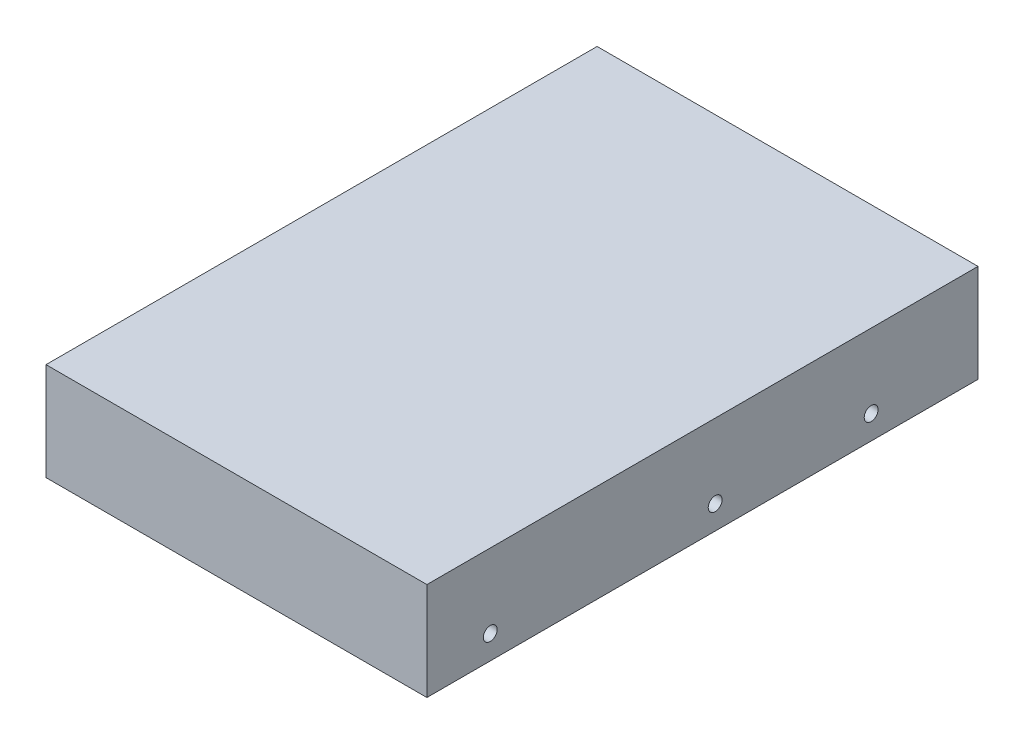
ISO-10303-21;
HEADER;
FILE_DESCRIPTION(('STEP AP214'),'2;1');
FILE_NAME('part.step','',(''),(''),'','','');
FILE_SCHEMA(('AUTOMOTIVE_DESIGN { 1 0 10303 214 1 1 1 1 }'));
ENDSEC;
DATA;
#1=APPLICATION_CONTEXT('core data for automotive mechanical design processes');
#2=APPLICATION_PROTOCOL_DEFINITION('international standard','automotive_design',2000,#1);
#3=PRODUCT_CONTEXT('',#1,'mechanical');
#4=PRODUCT('Part','Part','',(#3));
#5=PRODUCT_RELATED_PRODUCT_CATEGORY('part','',(#4));
#6=PRODUCT_DEFINITION_FORMATION('','',#4);
#7=PRODUCT_DEFINITION_CONTEXT('part definition',#1,'design');
#8=PRODUCT_DEFINITION('design','',#6,#7);
#9=PRODUCT_DEFINITION_SHAPE('','',#8);
#10=(LENGTH_UNIT() NAMED_UNIT(*) SI_UNIT(.MILLI.,.METRE.));
#11=(NAMED_UNIT(*) PLANE_ANGLE_UNIT() SI_UNIT($,.RADIAN.));
#12=(NAMED_UNIT(*) SI_UNIT($,.STERADIAN.) SOLID_ANGLE_UNIT());
#13=UNCERTAINTY_MEASURE_WITH_UNIT(LENGTH_MEASURE(1.E-05),#10,'distance_accuracy_value','');
#14=(GEOMETRIC_REPRESENTATION_CONTEXT(3) GLOBAL_UNCERTAINTY_ASSIGNED_CONTEXT((#13)) GLOBAL_UNIT_ASSIGNED_CONTEXT((#10,
#11,#12)) REPRESENTATION_CONTEXT('',''));
#15=CARTESIAN_POINT('',(0.,0.,0.));
#16=DIRECTION('',(0.,0.,1.));
#17=DIRECTION('',(1.,0.,0.));
#18=AXIS2_PLACEMENT_3D('',#15,#16,#17);
#19=CARTESIAN_POINT('',(0.,26.1,0.));
#20=DIRECTION('',(1.,0.,0.));
#21=DIRECTION('',(0.,0.,-1.));
#22=AXIS2_PLACEMENT_3D('',#19,#20,#21);
#23=PLANE('',#22);
#24=CARTESIAN_POINT('',(0.,6.35,-16.9));
#25=DIRECTION('',(-1.,0.,0.));
#26=DIRECTION('',(0.,0.,1.));
#27=AXIS2_PLACEMENT_3D('',#24,#25,#26);
#28=CIRCLE('',#27,1.85);
#29=CARTESIAN_POINT('',(0.,6.35,-15.05));
#30=VERTEX_POINT('',#29);
#31=EDGE_CURVE('E112',#30,#30,#28,.T.);
#32=ORIENTED_EDGE('',*,*,#31,.F.);
#33=EDGE_LOOP('',(#32));
#34=FACE_BOUND('',#33,.T.);
#35=CARTESIAN_POINT('',(0.,6.35,-76.89));
#36=DIRECTION('',(-1.,0.,0.));
#37=DIRECTION('',(0.,0.,1.));
#38=AXIS2_PLACEMENT_3D('',#35,#36,#37);
#39=CIRCLE('',#38,1.85);
#40=CARTESIAN_POINT('',(0.,6.35,-75.04));
#41=VERTEX_POINT('',#40);
#42=EDGE_CURVE('E111',#41,#41,#39,.T.);
#43=ORIENTED_EDGE('',*,*,#42,.F.);
#44=EDGE_LOOP('',(#43));
#45=FACE_BOUND('',#44,.T.);
#46=CARTESIAN_POINT('',(0.,6.35,-118.5));
#47=DIRECTION('',(-1.,0.,0.));
#48=DIRECTION('',(0.,0.,1.));
#49=AXIS2_PLACEMENT_3D('',#46,#47,#48);
#50=CIRCLE('',#49,1.85);
#51=CARTESIAN_POINT('',(0.,6.35,-116.65));
#52=VERTEX_POINT('',#51);
#53=EDGE_CURVE('E122',#52,#52,#50,.T.);
#54=ORIENTED_EDGE('',*,*,#53,.F.);
#55=EDGE_LOOP('',(#54));
#56=FACE_BOUND('',#55,.T.);
#57=DIRECTION('',(0.,0.,1.));
#58=VECTOR('',#57,1.);
#59=CARTESIAN_POINT('',(0.,0.,0.));
#60=LINE('',#59,#58);
#61=CARTESIAN_POINT('',(0.,0.,-147.));
#62=VERTEX_POINT('',#61);
#63=CARTESIAN_POINT('',(0.,0.,0.));
#64=VERTEX_POINT('',#63);
#65=EDGE_CURVE('E146',#62,#64,#60,.T.);
#66=ORIENTED_EDGE('',*,*,#65,.T.);
#67=DIRECTION('',(0.,-1.,0.));
#68=VECTOR('',#67,1.);
#69=CARTESIAN_POINT('',(0.,26.1,0.));
#70=LINE('',#69,#68);
#71=CARTESIAN_POINT('',(0.,26.1,0.));
#72=VERTEX_POINT('',#71);
#73=EDGE_CURVE('E11',#72,#64,#70,.T.);
#74=ORIENTED_EDGE('',*,*,#73,.F.);
#75=DIRECTION('',(0.,0.,1.));
#76=VECTOR('',#75,1.);
#77=CARTESIAN_POINT('',(0.,26.1,0.));
#78=LINE('',#77,#76);
#79=CARTESIAN_POINT('',(0.,26.1,-147.));
#80=VERTEX_POINT('',#79);
#81=EDGE_CURVE('E147',#80,#72,#78,.T.);
#82=ORIENTED_EDGE('',*,*,#81,.F.);
#83=DIRECTION('',(0.,-1.,0.));
#84=VECTOR('',#83,1.);
#85=CARTESIAN_POINT('',(0.,26.1,-147.));
#86=LINE('',#85,#84);
#87=EDGE_CURVE('E153',#80,#62,#86,.T.);
#88=ORIENTED_EDGE('',*,*,#87,.T.);
#89=EDGE_LOOP('',(#66,#74,#82,#88));
#90=FACE_BOUND('',#89,.T.);
#91=ADVANCED_FACE('F35',(#34,#45,#56,#90),#23,.F.);
#92=CARTESIAN_POINT('',(0.,26.1,0.));
#93=DIRECTION('',(0.,0.,-1.));
#94=DIRECTION('',(-1.,0.,0.));
#95=AXIS2_PLACEMENT_3D('',#92,#93,#94);
#96=PLANE('',#95);
#97=DIRECTION('',(1.,0.,0.));
#98=VECTOR('',#97,1.);
#99=CARTESIAN_POINT('',(0.,0.,0.));
#100=LINE('',#99,#98);
#101=CARTESIAN_POINT('',(101.6,0.,0.));
#102=VERTEX_POINT('',#101);
#103=EDGE_CURVE('E156',#64,#102,#100,.T.);
#104=ORIENTED_EDGE('',*,*,#103,.T.);
#105=DIRECTION('',(0.,-1.,0.));
#106=VECTOR('',#105,1.);
#107=CARTESIAN_POINT('',(101.6,26.1,0.));
#108=LINE('',#107,#106);
#109=CARTESIAN_POINT('',(101.6,26.1,0.));
#110=VERTEX_POINT('',#109);
#111=EDGE_CURVE('E43',#110,#102,#108,.T.);
#112=ORIENTED_EDGE('',*,*,#111,.F.);
#113=DIRECTION('',(1.,0.,0.));
#114=VECTOR('',#113,1.);
#115=CARTESIAN_POINT('',(0.,26.1,0.));
#116=LINE('',#115,#114);
#117=EDGE_CURVE('E82',#72,#110,#116,.T.);
#118=ORIENTED_EDGE('',*,*,#117,.F.);
#119=ORIENTED_EDGE('',*,*,#73,.T.);
#120=EDGE_LOOP('',(#104,#112,#118,#119));
#121=FACE_BOUND('',#120,.T.);
#122=ADVANCED_FACE('F179',(#121),#96,.F.);
#123=CARTESIAN_POINT('',(101.6,26.1,0.));
#124=DIRECTION('',(-1.,0.,0.));
#125=DIRECTION('',(0.,0.,1.));
#126=AXIS2_PLACEMENT_3D('',#123,#124,#125);
#127=PLANE('',#126);
#128=CARTESIAN_POINT('',(101.6,6.35,-16.9));
#129=DIRECTION('',(1.,0.,0.));
#130=DIRECTION('',(0.,0.,-1.));
#131=AXIS2_PLACEMENT_3D('',#128,#129,#130);
#132=CIRCLE('',#131,1.85);
#133=CARTESIAN_POINT('',(101.6,6.35,-18.75));
#134=VERTEX_POINT('',#133);
#135=EDGE_CURVE('E128',#134,#134,#132,.T.);
#136=ORIENTED_EDGE('',*,*,#135,.F.);
#137=EDGE_LOOP('',(#136));
#138=FACE_BOUND('',#137,.T.);
#139=CARTESIAN_POINT('',(101.6,6.35,-76.89));
#140=DIRECTION('',(1.,0.,0.));
#141=DIRECTION('',(0.,0.,-1.));
#142=AXIS2_PLACEMENT_3D('',#139,#140,#141);
#143=CIRCLE('',#142,1.85);
#144=CARTESIAN_POINT('',(101.6,6.35,-78.74));
#145=VERTEX_POINT('',#144);
#146=EDGE_CURVE('E134',#145,#145,#143,.T.);
#147=ORIENTED_EDGE('',*,*,#146,.F.);
#148=EDGE_LOOP('',(#147));
#149=FACE_BOUND('',#148,.T.);
#150=CARTESIAN_POINT('',(101.6,6.35,-118.5));
#151=DIRECTION('',(1.,0.,0.));
#152=DIRECTION('',(0.,0.,-1.));
#153=AXIS2_PLACEMENT_3D('',#150,#151,#152);
#154=CIRCLE('',#153,1.85);
#155=CARTESIAN_POINT('',(101.6,6.35,-120.35));
#156=VERTEX_POINT('',#155);
#157=EDGE_CURVE('E140',#156,#156,#154,.T.);
#158=ORIENTED_EDGE('',*,*,#157,.F.);
#159=EDGE_LOOP('',(#158));
#160=FACE_BOUND('',#159,.T.);
#161=DIRECTION('',(0.,0.,-1.));
#162=VECTOR('',#161,1.);
#163=CARTESIAN_POINT('',(101.6,0.,0.));
#164=LINE('',#163,#162);
#165=CARTESIAN_POINT('',(101.6,0.,-147.));
#166=VERTEX_POINT('',#165);
#167=EDGE_CURVE('E69',#102,#166,#164,.T.);
#168=ORIENTED_EDGE('',*,*,#167,.T.);
#169=DIRECTION('',(0.,-1.,0.));
#170=VECTOR('',#169,1.);
#171=CARTESIAN_POINT('',(101.6,26.1,-147.));
#172=LINE('',#171,#170);
#173=CARTESIAN_POINT('',(101.6,26.1,-147.));
#174=VERTEX_POINT('',#173);
#175=EDGE_CURVE('E161',#174,#166,#172,.T.);
#176=ORIENTED_EDGE('',*,*,#175,.F.);
#177=DIRECTION('',(0.,0.,-1.));
#178=VECTOR('',#177,1.);
#179=CARTESIAN_POINT('',(101.6,26.1,0.));
#180=LINE('',#179,#178);
#181=EDGE_CURVE('E150',#110,#174,#180,.T.);
#182=ORIENTED_EDGE('',*,*,#181,.F.);
#183=ORIENTED_EDGE('',*,*,#111,.T.);
#184=EDGE_LOOP('',(#168,#176,#182,#183));
#185=FACE_BOUND('',#184,.T.);
#186=ADVANCED_FACE('F163',(#138,#149,#160,#185),#127,.F.);
#187=CARTESIAN_POINT('',(0.,26.1,-147.));
#188=DIRECTION('',(0.,0.,1.));
#189=DIRECTION('',(1.,0.,0.));
#190=AXIS2_PLACEMENT_3D('',#187,#188,#189);
#191=PLANE('',#190);
#192=DIRECTION('',(-1.,0.,0.));
#193=VECTOR('',#192,1.);
#194=CARTESIAN_POINT('',(0.,0.,-147.));
#195=LINE('',#194,#193);
#196=EDGE_CURVE('E75',#166,#62,#195,.T.);
#197=ORIENTED_EDGE('',*,*,#196,.T.);
#198=ORIENTED_EDGE('',*,*,#87,.F.);
#199=DIRECTION('',(-1.,0.,0.));
#200=VECTOR('',#199,1.);
#201=CARTESIAN_POINT('',(0.,26.1,-147.));
#202=LINE('',#201,#200);
#203=EDGE_CURVE('E51',#174,#80,#202,.T.);
#204=ORIENTED_EDGE('',*,*,#203,.F.);
#205=ORIENTED_EDGE('',*,*,#175,.T.);
#206=EDGE_LOOP('',(#197,#198,#204,#205));
#207=FACE_BOUND('',#206,.T.);
#208=ADVANCED_FACE('F170',(#207),#191,.F.);
#209=CARTESIAN_POINT('',(0.,26.1,0.));
#210=DIRECTION('',(0.,-1.,0.));
#211=DIRECTION('',(0.,0.,-1.));
#212=AXIS2_PLACEMENT_3D('',#209,#210,#211);
#213=PLANE('',#212);
#214=ORIENTED_EDGE('',*,*,#81,.T.);
#215=ORIENTED_EDGE('',*,*,#117,.T.);
#216=ORIENTED_EDGE('',*,*,#181,.T.);
#217=ORIENTED_EDGE('',*,*,#203,.T.);
#218=EDGE_LOOP('',(#214,#215,#216,#217));
#219=FACE_BOUND('',#218,.T.);
#220=ADVANCED_FACE('F172',(#219),#213,.F.);
#221=CARTESIAN_POINT('',(0.,0.,0.));
#222=DIRECTION('',(0.,-1.,0.));
#223=DIRECTION('',(0.,0.,-1.));
#224=AXIS2_PLACEMENT_3D('',#221,#222,#223);
#225=PLANE('',#224);
#226=ORIENTED_EDGE('',*,*,#65,.F.);
#227=ORIENTED_EDGE('',*,*,#196,.F.);
#228=ORIENTED_EDGE('',*,*,#167,.F.);
#229=ORIENTED_EDGE('',*,*,#103,.F.);
#230=EDGE_LOOP('',(#226,#227,#228,#229));
#231=FACE_BOUND('',#230,.T.);
#232=ADVANCED_FACE('F166',(#231),#225,.T.);
#233=CARTESIAN_POINT('',(97.1,6.35,-118.5));
#234=DIRECTION('',(1.,0.,0.));
#235=DIRECTION('',(0.,0.,-1.));
#236=AXIS2_PLACEMENT_3D('',#233,#234,#235);
#237=CONICAL_SURFACE('',#236,1.85,1.02974425867665);
#238=CARTESIAN_POINT('',(95.988407854799,6.35,-118.5));
#239=VERTEX_POINT('',#238);
#240=VERTEX_LOOP('',#239);
#241=FACE_BOUND('',#240,.T.);
#242=CARTESIAN_POINT('',(97.1,6.35,-118.5));
#243=DIRECTION('',(1.,0.,0.));
#244=DIRECTION('',(0.,0.,-1.));
#245=AXIS2_PLACEMENT_3D('',#242,#243,#244);
#246=CIRCLE('',#245,1.85);
#247=CARTESIAN_POINT('',(97.1,6.35,-120.35));
#248=VERTEX_POINT('',#247);
#249=EDGE_CURVE('E143',#248,#248,#246,.T.);
#250=ORIENTED_EDGE('',*,*,#249,.T.);
#251=EDGE_LOOP('',(#250));
#252=FACE_BOUND('',#251,.T.);
#253=ADVANCED_FACE('F230',(#241,#252),#237,.F.);
#254=CARTESIAN_POINT('',(101.6,6.35,-118.5));
#255=DIRECTION('',(1.,0.,0.));
#256=DIRECTION('',(0.,0.,-1.));
#257=AXIS2_PLACEMENT_3D('',#254,#255,#256);
#258=CYLINDRICAL_SURFACE('',#257,1.85);
#259=ORIENTED_EDGE('',*,*,#249,.F.);
#260=EDGE_LOOP('',(#259));
#261=FACE_BOUND('',#260,.T.);
#262=ORIENTED_EDGE('',*,*,#157,.T.);
#263=EDGE_LOOP('',(#262));
#264=FACE_BOUND('',#263,.T.);
#265=ADVANCED_FACE('F226',(#261,#264),#258,.F.);
#266=CARTESIAN_POINT('',(97.1,6.35,-76.89));
#267=DIRECTION('',(1.,0.,0.));
#268=DIRECTION('',(0.,0.,-1.));
#269=AXIS2_PLACEMENT_3D('',#266,#267,#268);
#270=CONICAL_SURFACE('',#269,1.85,1.02974425867665);
#271=CARTESIAN_POINT('',(95.988407854799,6.35,-76.89));
#272=VERTEX_POINT('',#271);
#273=VERTEX_LOOP('',#272);
#274=FACE_BOUND('',#273,.T.);
#275=CARTESIAN_POINT('',(97.1,6.35,-76.89));
#276=DIRECTION('',(1.,0.,0.));
#277=DIRECTION('',(0.,0.,-1.));
#278=AXIS2_PLACEMENT_3D('',#275,#276,#277);
#279=CIRCLE('',#278,1.85);
#280=CARTESIAN_POINT('',(97.1,6.35,-78.74));
#281=VERTEX_POINT('',#280);
#282=EDGE_CURVE('E137',#281,#281,#279,.T.);
#283=ORIENTED_EDGE('',*,*,#282,.T.);
#284=EDGE_LOOP('',(#283));
#285=FACE_BOUND('',#284,.T.);
#286=ADVANCED_FACE('F222',(#274,#285),#270,.F.);
#287=CARTESIAN_POINT('',(101.6,6.35,-76.89));
#288=DIRECTION('',(1.,0.,0.));
#289=DIRECTION('',(0.,0.,-1.));
#290=AXIS2_PLACEMENT_3D('',#287,#288,#289);
#291=CYLINDRICAL_SURFACE('',#290,1.85);
#292=ORIENTED_EDGE('',*,*,#282,.F.);
#293=EDGE_LOOP('',(#292));
#294=FACE_BOUND('',#293,.T.);
#295=ORIENTED_EDGE('',*,*,#146,.T.);
#296=EDGE_LOOP('',(#295));
#297=FACE_BOUND('',#296,.T.);
#298=ADVANCED_FACE('F218',(#294,#297),#291,.F.);
#299=CARTESIAN_POINT('',(97.1,6.35,-16.9));
#300=DIRECTION('',(1.,0.,0.));
#301=DIRECTION('',(0.,0.,-1.));
#302=AXIS2_PLACEMENT_3D('',#299,#300,#301);
#303=CONICAL_SURFACE('',#302,1.85,1.02974425867665);
#304=CARTESIAN_POINT('',(95.988407854799,6.35,-16.9));
#305=VERTEX_POINT('',#304);
#306=VERTEX_LOOP('',#305);
#307=FACE_BOUND('',#306,.T.);
#308=CARTESIAN_POINT('',(97.1,6.35,-16.9));
#309=DIRECTION('',(1.,0.,0.));
#310=DIRECTION('',(0.,0.,-1.));
#311=AXIS2_PLACEMENT_3D('',#308,#309,#310);
#312=CIRCLE('',#311,1.85);
#313=CARTESIAN_POINT('',(97.1,6.35,-18.75));
#314=VERTEX_POINT('',#313);
#315=EDGE_CURVE('E131',#314,#314,#312,.T.);
#316=ORIENTED_EDGE('',*,*,#315,.T.);
#317=EDGE_LOOP('',(#316));
#318=FACE_BOUND('',#317,.T.);
#319=ADVANCED_FACE('F214',(#307,#318),#303,.F.);
#320=CARTESIAN_POINT('',(101.6,6.35,-16.9));
#321=DIRECTION('',(1.,0.,0.));
#322=DIRECTION('',(0.,0.,-1.));
#323=AXIS2_PLACEMENT_3D('',#320,#321,#322);
#324=CYLINDRICAL_SURFACE('',#323,1.85);
#325=ORIENTED_EDGE('',*,*,#315,.F.);
#326=EDGE_LOOP('',(#325));
#327=FACE_BOUND('',#326,.T.);
#328=ORIENTED_EDGE('',*,*,#135,.T.);
#329=EDGE_LOOP('',(#328));
#330=FACE_BOUND('',#329,.T.);
#331=ADVANCED_FACE('F206',(#327,#330),#324,.F.);
#332=CARTESIAN_POINT('',(4.5,6.35,-118.5));
#333=DIRECTION('',(-1.,0.,0.));
#334=DIRECTION('',(0.,0.,1.));
#335=AXIS2_PLACEMENT_3D('',#332,#333,#334);
#336=CONICAL_SURFACE('',#335,1.85,1.02974425867665);
#337=CARTESIAN_POINT('',(5.61159214520099,6.35,-118.5));
#338=VERTEX_POINT('',#337);
#339=VERTEX_LOOP('',#338);
#340=FACE_BOUND('',#339,.T.);
#341=CARTESIAN_POINT('',(4.5,6.35,-118.5));
#342=DIRECTION('',(-1.,0.,0.));
#343=DIRECTION('',(0.,0.,1.));
#344=AXIS2_PLACEMENT_3D('',#341,#342,#343);
#345=CIRCLE('',#344,1.85);
#346=CARTESIAN_POINT('',(4.5,6.35,-116.65));
#347=VERTEX_POINT('',#346);
#348=EDGE_CURVE('E125',#347,#347,#345,.T.);
#349=ORIENTED_EDGE('',*,*,#348,.T.);
#350=EDGE_LOOP('',(#349));
#351=FACE_BOUND('',#350,.T.);
#352=ADVANCED_FACE('F197',(#340,#351),#336,.F.);
#353=CARTESIAN_POINT('',(0.,6.35,-118.5));
#354=DIRECTION('',(-1.,0.,0.));
#355=DIRECTION('',(0.,0.,1.));
#356=AXIS2_PLACEMENT_3D('',#353,#354,#355);
#357=CYLINDRICAL_SURFACE('',#356,1.85);
#358=ORIENTED_EDGE('',*,*,#348,.F.);
#359=EDGE_LOOP('',(#358));
#360=FACE_BOUND('',#359,.T.);
#361=ORIENTED_EDGE('',*,*,#53,.T.);
#362=EDGE_LOOP('',(#361));
#363=FACE_BOUND('',#362,.T.);
#364=ADVANCED_FACE('F194',(#360,#363),#357,.F.);
#365=CARTESIAN_POINT('',(4.5,6.35,-76.89));
#366=DIRECTION('',(-1.,0.,0.));
#367=DIRECTION('',(0.,0.,1.));
#368=AXIS2_PLACEMENT_3D('',#365,#366,#367);
#369=CONICAL_SURFACE('',#368,1.85,1.02974425867665);
#370=CARTESIAN_POINT('',(5.61159214520099,6.35,-76.89));
#371=VERTEX_POINT('',#370);
#372=VERTEX_LOOP('',#371);
#373=FACE_BOUND('',#372,.T.);
#374=CARTESIAN_POINT('',(4.5,6.35,-76.89));
#375=DIRECTION('',(-1.,0.,0.));
#376=DIRECTION('',(0.,0.,1.));
#377=AXIS2_PLACEMENT_3D('',#374,#375,#376);
#378=CIRCLE('',#377,1.85);
#379=CARTESIAN_POINT('',(4.5,6.35,-75.04));
#380=VERTEX_POINT('',#379);
#381=EDGE_CURVE('E115',#380,#380,#378,.T.);
#382=ORIENTED_EDGE('',*,*,#381,.T.);
#383=EDGE_LOOP('',(#382));
#384=FACE_BOUND('',#383,.T.);
#385=ADVANCED_FACE('F196',(#373,#384),#369,.F.);
#386=CARTESIAN_POINT('',(0.,6.35,-76.89));
#387=DIRECTION('',(-1.,0.,0.));
#388=DIRECTION('',(0.,0.,1.));
#389=AXIS2_PLACEMENT_3D('',#386,#387,#388);
#390=CYLINDRICAL_SURFACE('',#389,1.85);
#391=ORIENTED_EDGE('',*,*,#381,.F.);
#392=EDGE_LOOP('',(#391));
#393=FACE_BOUND('',#392,.T.);
#394=ORIENTED_EDGE('',*,*,#42,.T.);
#395=EDGE_LOOP('',(#394));
#396=FACE_BOUND('',#395,.T.);
#397=ADVANCED_FACE('F105',(#393,#396),#390,.F.);
#398=CARTESIAN_POINT('',(4.5,6.35,-16.9));
#399=DIRECTION('',(-1.,0.,0.));
#400=DIRECTION('',(0.,0.,1.));
#401=AXIS2_PLACEMENT_3D('',#398,#399,#400);
#402=CONICAL_SURFACE('',#401,1.85,1.02974425867665);
#403=CARTESIAN_POINT('',(5.61159214520099,6.35,-16.9));
#404=VERTEX_POINT('',#403);
#405=VERTEX_LOOP('',#404);
#406=FACE_BOUND('',#405,.T.);
#407=CARTESIAN_POINT('',(4.5,6.35,-16.9));
#408=DIRECTION('',(-1.,0.,0.));
#409=DIRECTION('',(0.,0.,1.));
#410=AXIS2_PLACEMENT_3D('',#407,#408,#409);
#411=CIRCLE('',#410,1.85);
#412=CARTESIAN_POINT('',(4.5,6.35,-15.05));
#413=VERTEX_POINT('',#412);
#414=EDGE_CURVE('E109',#413,#413,#411,.T.);
#415=ORIENTED_EDGE('',*,*,#414,.T.);
#416=EDGE_LOOP('',(#415));
#417=FACE_BOUND('',#416,.T.);
#418=ADVANCED_FACE('F101',(#406,#417),#402,.F.);
#419=CARTESIAN_POINT('',(0.,6.35,-16.9));
#420=DIRECTION('',(-1.,0.,0.));
#421=DIRECTION('',(0.,0.,1.));
#422=AXIS2_PLACEMENT_3D('',#419,#420,#421);
#423=CYLINDRICAL_SURFACE('',#422,1.85);
#424=ORIENTED_EDGE('',*,*,#414,.F.);
#425=EDGE_LOOP('',(#424));
#426=FACE_BOUND('',#425,.T.);
#427=ORIENTED_EDGE('',*,*,#31,.T.);
#428=EDGE_LOOP('',(#427));
#429=FACE_BOUND('',#428,.T.);
#430=ADVANCED_FACE('F104',(#426,#429),#423,.F.);
#431=CLOSED_SHELL('',(#91,#122,#186,#208,#220,#232,#253,#265,#286,#298,#319,#331,#352,#364,#385,
#397,#418,#430));
#432=MANIFOLD_SOLID_BREP('B2',#431);
#433=ADVANCED_BREP_SHAPE_REPRESENTATION('',(#18,#432),#14);
#434=SHAPE_DEFINITION_REPRESENTATION(#9,#433);
ENDSEC;
END-ISO-10303-21;
